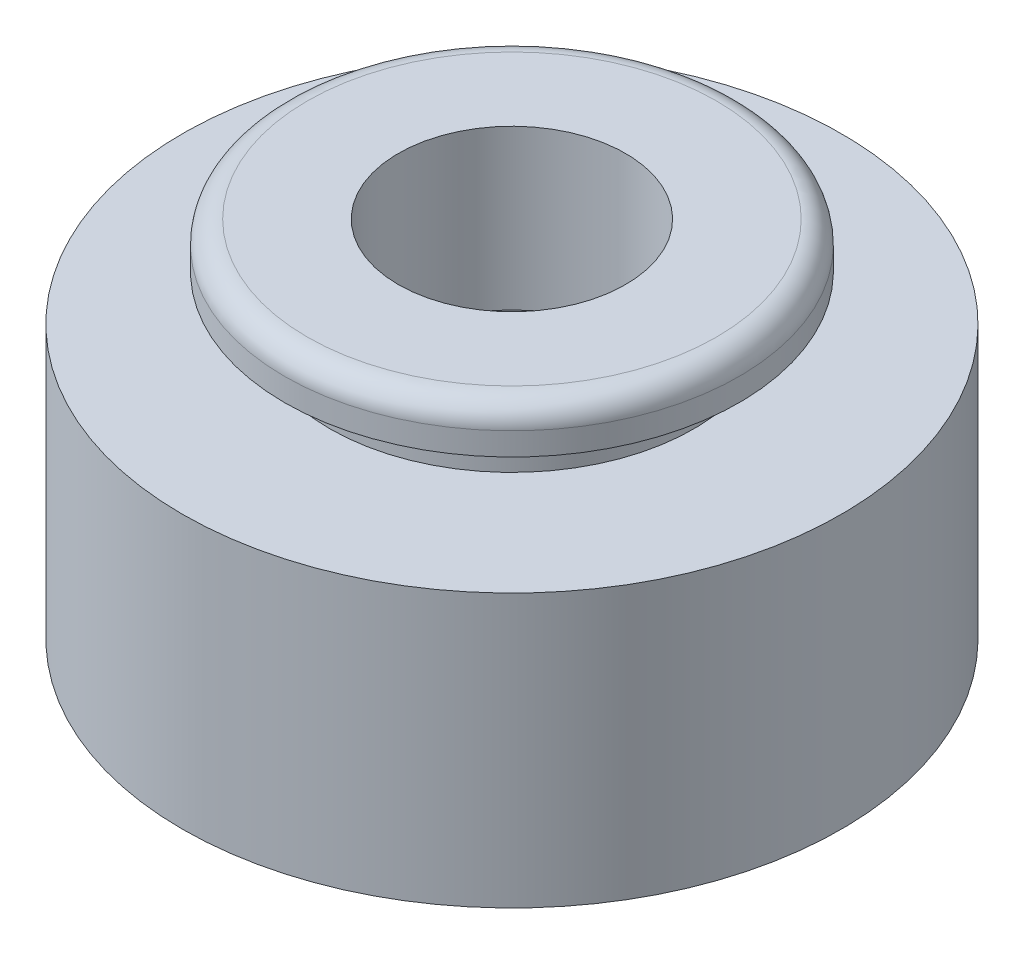
ISO-10303-21;
HEADER;
FILE_DESCRIPTION(('STEP AP214'),'2;1');
FILE_NAME('part.step','',(''),(''),'','','');
FILE_SCHEMA(('AUTOMOTIVE_DESIGN { 1 0 10303 214 1 1 1 1 }'));
ENDSEC;
DATA;
#1=APPLICATION_CONTEXT('core data for automotive mechanical design processes');
#2=APPLICATION_PROTOCOL_DEFINITION('international standard','automotive_design',2000,#1);
#3=PRODUCT_CONTEXT('',#1,'mechanical');
#4=PRODUCT('Part','Part','',(#3));
#5=PRODUCT_RELATED_PRODUCT_CATEGORY('part','',(#4));
#6=PRODUCT_DEFINITION_FORMATION('','',#4);
#7=PRODUCT_DEFINITION_CONTEXT('part definition',#1,'design');
#8=PRODUCT_DEFINITION('design','',#6,#7);
#9=PRODUCT_DEFINITION_SHAPE('','',#8);
#10=(LENGTH_UNIT() NAMED_UNIT(*) SI_UNIT(.MILLI.,.METRE.));
#11=(NAMED_UNIT(*) PLANE_ANGLE_UNIT() SI_UNIT($,.RADIAN.));
#12=(NAMED_UNIT(*) SI_UNIT($,.STERADIAN.) SOLID_ANGLE_UNIT());
#13=UNCERTAINTY_MEASURE_WITH_UNIT(LENGTH_MEASURE(1.E-05),#10,'distance_accuracy_value','');
#14=(GEOMETRIC_REPRESENTATION_CONTEXT(3) GLOBAL_UNCERTAINTY_ASSIGNED_CONTEXT((#13)) GLOBAL_UNIT_ASSIGNED_CONTEXT((#10,
#11,#12)) REPRESENTATION_CONTEXT('',''));
#15=CARTESIAN_POINT('',(0.,0.,0.));
#16=DIRECTION('',(0.,0.,1.));
#17=DIRECTION('',(1.,0.,0.));
#18=AXIS2_PLACEMENT_3D('',#15,#16,#17);
#19=CARTESIAN_POINT('',(0.,12.,0.));
#20=DIRECTION('',(0.,-1.,0.));
#21=DIRECTION('',(0.,0.,-1.));
#22=AXIS2_PLACEMENT_3D('',#19,#20,#21);
#23=CYLINDRICAL_SURFACE('',#22,7.5);
#24=CARTESIAN_POINT('',(0.,0.,0.));
#25=DIRECTION('',(0.,1.,0.));
#26=DIRECTION('',(0.,0.,1.));
#27=AXIS2_PLACEMENT_3D('',#24,#25,#26);
#28=CIRCLE('',#27,7.5);
#29=CARTESIAN_POINT('',(0.,0.,7.5));
#30=VERTEX_POINT('',#29);
#31=EDGE_CURVE('E53',#30,#30,#28,.T.);
#32=ORIENTED_EDGE('',*,*,#31,.F.);
#33=EDGE_LOOP('',(#32));
#34=FACE_BOUND('',#33,.T.);
#35=CARTESIAN_POINT('',(0.,9.,0.));
#36=DIRECTION('',(0.,1.,0.));
#37=DIRECTION('',(0.,0.,1.));
#38=AXIS2_PLACEMENT_3D('',#35,#36,#37);
#39=CIRCLE('',#38,7.5);
#40=CARTESIAN_POINT('',(0.,9.,7.5));
#41=VERTEX_POINT('',#40);
#42=EDGE_CURVE('E50',#41,#41,#39,.T.);
#43=ORIENTED_EDGE('',*,*,#42,.T.);
#44=EDGE_LOOP('',(#43));
#45=FACE_BOUND('',#44,.T.);
#46=ADVANCED_FACE('F32',(#34,#45),#23,.F.);
#47=CARTESIAN_POINT('',(0.,12.,0.));
#48=DIRECTION('',(0.,1.,0.));
#49=DIRECTION('',(0.,0.,1.));
#50=AXIS2_PLACEMENT_3D('',#47,#48,#49);
#51=PLANE('',#50);
#52=CARTESIAN_POINT('',(0.,12.,0.));
#53=DIRECTION('',(0.,1.,0.));
#54=DIRECTION('',(0.,0.,1.));
#55=AXIS2_PLACEMENT_3D('',#52,#53,#54);
#56=CIRCLE('',#55,8.);
#57=CARTESIAN_POINT('',(0.,12.,8.));
#58=VERTEX_POINT('',#57);
#59=EDGE_CURVE('E43',#58,#58,#56,.T.);
#60=ORIENTED_EDGE('',*,*,#59,.F.);
#61=EDGE_LOOP('',(#60));
#62=FACE_BOUND('',#61,.T.);
#63=CARTESIAN_POINT('',(0.,12.,0.));
#64=DIRECTION('',(0.,1.,0.));
#65=DIRECTION('',(0.,0.,1.));
#66=AXIS2_PLACEMENT_3D('',#63,#64,#65);
#67=CIRCLE('',#66,14.5);
#68=CARTESIAN_POINT('',(0.,12.,14.5));
#69=VERTEX_POINT('',#68);
#70=EDGE_CURVE('E47',#69,#69,#67,.T.);
#71=ORIENTED_EDGE('',*,*,#70,.T.);
#72=EDGE_LOOP('',(#71));
#73=FACE_BOUND('',#72,.T.);
#74=ADVANCED_FACE('F91',(#62,#73),#51,.T.);
#75=CARTESIAN_POINT('',(0.,0.,0.));
#76=DIRECTION('',(0.,1.,0.));
#77=DIRECTION('',(0.,0.,1.));
#78=AXIS2_PLACEMENT_3D('',#75,#76,#77);
#79=PLANE('',#78);
#80=CARTESIAN_POINT('',(0.,0.,0.));
#81=DIRECTION('',(0.,1.,0.));
#82=DIRECTION('',(0.,0.,1.));
#83=AXIS2_PLACEMENT_3D('',#80,#81,#82);
#84=CIRCLE('',#83,14.5);
#85=CARTESIAN_POINT('',(0.,0.,14.5));
#86=VERTEX_POINT('',#85);
#87=EDGE_CURVE('E55',#86,#86,#84,.T.);
#88=ORIENTED_EDGE('',*,*,#87,.F.);
#89=EDGE_LOOP('',(#88));
#90=FACE_BOUND('',#89,.T.);
#91=ORIENTED_EDGE('',*,*,#31,.T.);
#92=EDGE_LOOP('',(#91));
#93=FACE_BOUND('',#92,.T.);
#94=ADVANCED_FACE('F97',(#90,#93),#79,.F.);
#95=CARTESIAN_POINT('',(0.,12.,0.));
#96=DIRECTION('',(0.,-1.,0.));
#97=DIRECTION('',(0.,0.,-1.));
#98=AXIS2_PLACEMENT_3D('',#95,#96,#97);
#99=CYLINDRICAL_SURFACE('',#98,14.5);
#100=ORIENTED_EDGE('',*,*,#70,.F.);
#101=EDGE_LOOP('',(#100));
#102=FACE_BOUND('',#101,.T.);
#103=ORIENTED_EDGE('',*,*,#87,.T.);
#104=EDGE_LOOP('',(#103));
#105=FACE_BOUND('',#104,.T.);
#106=ADVANCED_FACE('F106',(#102,#105),#99,.T.);
#107=CARTESIAN_POINT('',(0.,9.,0.));
#108=DIRECTION('',(0.,1.,0.));
#109=DIRECTION('',(0.,0.,1.));
#110=AXIS2_PLACEMENT_3D('',#107,#108,#109);
#111=PLANE('',#110);
#112=CARTESIAN_POINT('',(0.,9.,0.));
#113=DIRECTION('',(0.,1.,0.));
#114=DIRECTION('',(0.,0.,1.));
#115=AXIS2_PLACEMENT_3D('',#112,#113,#114);
#116=CIRCLE('',#115,5.);
#117=CARTESIAN_POINT('',(0.,9.,5.));
#118=VERTEX_POINT('',#117);
#119=EDGE_CURVE('E54',#118,#118,#116,.T.);
#120=ORIENTED_EDGE('',*,*,#119,.T.);
#121=EDGE_LOOP('',(#120));
#122=FACE_BOUND('',#121,.T.);
#123=ORIENTED_EDGE('',*,*,#42,.F.);
#124=EDGE_LOOP('',(#123));
#125=FACE_BOUND('',#124,.T.);
#126=ADVANCED_FACE('F109',(#122,#125),#111,.F.);
#127=CARTESIAN_POINT('',(0.,9.,0.));
#128=DIRECTION('',(0.,1.,0.));
#129=DIRECTION('',(0.,0.,1.));
#130=AXIS2_PLACEMENT_3D('',#127,#128,#129);
#131=CYLINDRICAL_SURFACE('',#130,8.);
#132=ORIENTED_EDGE('',*,*,#59,.T.);
#133=EDGE_LOOP('',(#132));
#134=FACE_BOUND('',#133,.T.);
#135=CARTESIAN_POINT('',(0.,14.,0.));
#136=DIRECTION('',(0.,1.,0.));
#137=DIRECTION('',(0.,0.,1.));
#138=AXIS2_PLACEMENT_3D('',#135,#136,#137);
#139=CIRCLE('',#138,8.);
#140=CARTESIAN_POINT('',(0.,14.,8.));
#141=VERTEX_POINT('',#140);
#142=EDGE_CURVE('E64',#141,#141,#139,.T.);
#143=ORIENTED_EDGE('',*,*,#142,.F.);
#144=EDGE_LOOP('',(#143));
#145=FACE_BOUND('',#144,.T.);
#146=ADVANCED_FACE('F87',(#134,#145),#131,.T.);
#147=CARTESIAN_POINT('',(0.,9.,0.));
#148=DIRECTION('',(0.,1.,0.));
#149=DIRECTION('',(0.,0.,1.));
#150=AXIS2_PLACEMENT_3D('',#147,#148,#149);
#151=CYLINDRICAL_SURFACE('',#150,5.);
#152=ORIENTED_EDGE('',*,*,#119,.F.);
#153=EDGE_LOOP('',(#152));
#154=FACE_BOUND('',#153,.T.);
#155=CARTESIAN_POINT('',(0.,16.,0.));
#156=DIRECTION('',(0.,1.,0.));
#157=DIRECTION('',(0.,0.,1.));
#158=AXIS2_PLACEMENT_3D('',#155,#156,#157);
#159=CIRCLE('',#158,5.);
#160=CARTESIAN_POINT('',(0.,16.,5.));
#161=VERTEX_POINT('',#160);
#162=EDGE_CURVE('E70',#161,#161,#159,.T.);
#163=ORIENTED_EDGE('',*,*,#162,.T.);
#164=EDGE_LOOP('',(#163));
#165=FACE_BOUND('',#164,.T.);
#166=ADVANCED_FACE('F74',(#154,#165),#151,.F.);
#167=CARTESIAN_POINT('',(0.,16.,0.));
#168=DIRECTION('',(0.,1.,0.));
#169=DIRECTION('',(0.,0.,1.));
#170=AXIS2_PLACEMENT_3D('',#167,#168,#169);
#171=PLANE('',#170);
#172=CARTESIAN_POINT('',(0.,16.,0.));
#173=DIRECTION('',(0.,1.,0.));
#174=DIRECTION('',(0.,0.,1.));
#175=AXIS2_PLACEMENT_3D('',#172,#173,#174);
#176=CIRCLE('',#175,9.);
#177=CARTESIAN_POINT('',(0.,16.,9.));
#178=VERTEX_POINT('',#177);
#179=EDGE_CURVE('E39',#178,#178,#176,.T.);
#180=ORIENTED_EDGE('',*,*,#179,.T.);
#181=EDGE_LOOP('',(#180));
#182=FACE_BOUND('',#181,.T.);
#183=ORIENTED_EDGE('',*,*,#162,.F.);
#184=EDGE_LOOP('',(#183));
#185=FACE_BOUND('',#184,.T.);
#186=ADVANCED_FACE('F76',(#182,#185),#171,.T.);
#187=CARTESIAN_POINT('',(0.,14.,0.));
#188=DIRECTION('',(0.,1.,0.));
#189=DIRECTION('',(0.,0.,1.));
#190=AXIS2_PLACEMENT_3D('',#187,#188,#189);
#191=PLANE('',#190);
#192=ORIENTED_EDGE('',*,*,#142,.T.);
#193=EDGE_LOOP('',(#192));
#194=FACE_BOUND('',#193,.T.);
#195=CARTESIAN_POINT('',(0.,14.,0.));
#196=DIRECTION('',(0.,1.,0.));
#197=DIRECTION('',(0.,0.,1.));
#198=AXIS2_PLACEMENT_3D('',#195,#196,#197);
#199=CIRCLE('',#198,10.);
#200=CARTESIAN_POINT('',(0.,14.,10.));
#201=VERTEX_POINT('',#200);
#202=EDGE_CURVE('E67',#201,#201,#199,.T.);
#203=ORIENTED_EDGE('',*,*,#202,.F.);
#204=EDGE_LOOP('',(#203));
#205=FACE_BOUND('',#204,.T.);
#206=ADVANCED_FACE('F78',(#194,#205),#191,.F.);
#207=CARTESIAN_POINT('',(0.,16.,0.));
#208=DIRECTION('',(0.,-1.,0.));
#209=DIRECTION('',(0.,0.,-1.));
#210=AXIS2_PLACEMENT_3D('',#207,#208,#209);
#211=CYLINDRICAL_SURFACE('',#210,10.);
#212=CARTESIAN_POINT('',(0.,15.,0.));
#213=DIRECTION('',(0.,1.,0.));
#214=DIRECTION('',(0.,0.,1.));
#215=AXIS2_PLACEMENT_3D('',#212,#213,#214);
#216=CIRCLE('',#215,10.);
#217=CARTESIAN_POINT('',(0.,15.,10.));
#218=VERTEX_POINT('',#217);
#219=EDGE_CURVE('E10',#218,#218,#216,.F.);
#220=ORIENTED_EDGE('',*,*,#219,.T.);
#221=EDGE_LOOP('',(#220));
#222=FACE_BOUND('',#221,.T.);
#223=ORIENTED_EDGE('',*,*,#202,.T.);
#224=EDGE_LOOP('',(#223));
#225=FACE_BOUND('',#224,.T.);
#226=ADVANCED_FACE('F84',(#222,#225),#211,.T.);
#227=CARTESIAN_POINT('',(0.,15.,0.));
#228=DIRECTION('',(0.,1.,0.));
#229=DIRECTION('',(0.,0.,1.));
#230=AXIS2_PLACEMENT_3D('',#227,#228,#229);
#231=TOROIDAL_SURFACE('',#230,9.,1.);
#232=ORIENTED_EDGE('',*,*,#219,.F.);
#233=EDGE_LOOP('',(#232));
#234=FACE_BOUND('',#233,.T.);
#235=ORIENTED_EDGE('',*,*,#179,.F.);
#236=EDGE_LOOP('',(#235));
#237=FACE_BOUND('',#236,.T.);
#238=ADVANCED_FACE('F34',(#234,#237),#231,.T.);
#239=CLOSED_SHELL('',(#46,#74,#94,#106,#126,#146,#166,#186,#206,#226,#238));
#240=MANIFOLD_SOLID_BREP('B2',#239);
#241=ADVANCED_BREP_SHAPE_REPRESENTATION('',(#18,#240),#14);
#242=SHAPE_DEFINITION_REPRESENTATION(#9,#241);
ENDSEC;
END-ISO-10303-21;
